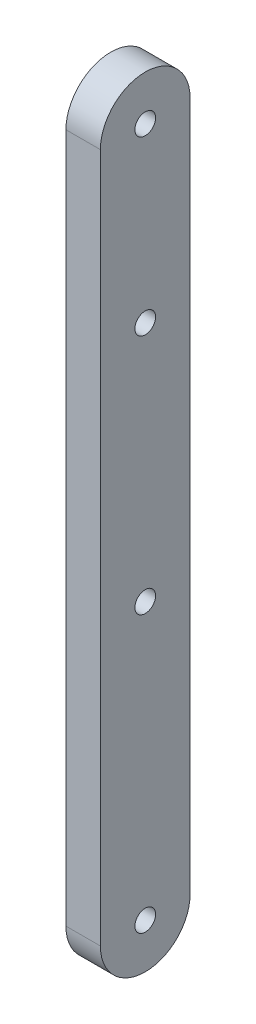
ISO-10303-21;
HEADER;
FILE_DESCRIPTION(('STEP AP214'),'2;1');
FILE_NAME('part.step','',(''),(''),'','','');
FILE_SCHEMA(('AUTOMOTIVE_DESIGN { 1 0 10303 214 1 1 1 1 }'));
ENDSEC;
DATA;
#1=APPLICATION_CONTEXT('core data for automotive mechanical design processes');
#2=APPLICATION_PROTOCOL_DEFINITION('international standard','automotive_design',2000,#1);
#3=PRODUCT_CONTEXT('',#1,'mechanical');
#4=PRODUCT('Part','Part','',(#3));
#5=PRODUCT_RELATED_PRODUCT_CATEGORY('part','',(#4));
#6=PRODUCT_DEFINITION_FORMATION('','',#4);
#7=PRODUCT_DEFINITION_CONTEXT('part definition',#1,'design');
#8=PRODUCT_DEFINITION('design','',#6,#7);
#9=PRODUCT_DEFINITION_SHAPE('','',#8);
#10=(LENGTH_UNIT() NAMED_UNIT(*) SI_UNIT(.MILLI.,.METRE.));
#11=(NAMED_UNIT(*) PLANE_ANGLE_UNIT() SI_UNIT($,.RADIAN.));
#12=(NAMED_UNIT(*) SI_UNIT($,.STERADIAN.) SOLID_ANGLE_UNIT());
#13=UNCERTAINTY_MEASURE_WITH_UNIT(LENGTH_MEASURE(1.E-05),#10,'distance_accuracy_value','');
#14=(GEOMETRIC_REPRESENTATION_CONTEXT(3) GLOBAL_UNCERTAINTY_ASSIGNED_CONTEXT((#13)) GLOBAL_UNIT_ASSIGNED_CONTEXT((#10,
#11,#12)) REPRESENTATION_CONTEXT('',''));
#15=CARTESIAN_POINT('',(0.,0.,0.));
#16=DIRECTION('',(0.,0.,1.));
#17=DIRECTION('',(1.,0.,0.));
#18=AXIS2_PLACEMENT_3D('',#15,#16,#17);
#19=CARTESIAN_POINT('',(5.,50.,0.));
#20=DIRECTION('',(-1.,0.,0.));
#21=DIRECTION('',(0.,0.,1.));
#22=AXIS2_PLACEMENT_3D('',#19,#20,#21);
#23=PLANE('',#22);
#24=CARTESIAN_POINT('',(5.,50.,0.));
#25=DIRECTION('',(1.,0.,0.));
#26=DIRECTION('',(0.,0.,1.));
#27=AXIS2_PLACEMENT_3D('',#24,#25,#26);
#28=CIRCLE('',#27,6.49999999999998);
#29=CARTESIAN_POINT('',(5.,50.,-6.49999999999998));
#30=VERTEX_POINT('',#29);
#31=CARTESIAN_POINT('',(5.,50.,6.49999999999998));
#32=VERTEX_POINT('',#31);
#33=EDGE_CURVE('E92',#30,#32,#28,.T.);
#34=ORIENTED_EDGE('',*,*,#33,.T.);
#35=DIRECTION('',(0.,-1.,0.));
#36=VECTOR('',#35,1.);
#37=CARTESIAN_POINT('',(5.,50.,6.49999999999998));
#38=LINE('',#37,#36);
#39=CARTESIAN_POINT('',(5.,-50.,6.49999999999995));
#40=VERTEX_POINT('',#39);
#41=EDGE_CURVE('E87',#32,#40,#38,.T.);
#42=ORIENTED_EDGE('',*,*,#41,.T.);
#43=CARTESIAN_POINT('',(5.,-50.,0.));
#44=DIRECTION('',(1.,0.,0.));
#45=DIRECTION('',(0.,0.,1.));
#46=AXIS2_PLACEMENT_3D('',#43,#44,#45);
#47=CIRCLE('',#46,6.49999999999998);
#48=CARTESIAN_POINT('',(5.,-50.,-6.49999999999999));
#49=VERTEX_POINT('',#48);
#50=EDGE_CURVE('E90',#40,#49,#47,.T.);
#51=ORIENTED_EDGE('',*,*,#50,.T.);
#52=DIRECTION('',(0.,1.,0.));
#53=VECTOR('',#52,1.);
#54=CARTESIAN_POINT('',(5.,50.,-6.49999999999998));
#55=LINE('',#54,#53);
#56=EDGE_CURVE('E57',#49,#30,#55,.T.);
#57=ORIENTED_EDGE('',*,*,#56,.T.);
#58=EDGE_LOOP('',(#34,#42,#51,#57));
#59=FACE_BOUND('',#58,.T.);
#60=CARTESIAN_POINT('',(5.,50.,0.));
#61=DIRECTION('',(1.,0.,0.));
#62=DIRECTION('',(0.,0.,-1.));
#63=AXIS2_PLACEMENT_3D('',#60,#61,#62);
#64=CIRCLE('',#63,1.5);
#65=CARTESIAN_POINT('',(5.,50.,-1.49999999999998));
#66=VERTEX_POINT('',#65);
#67=EDGE_CURVE('E112',#66,#66,#64,.T.);
#68=ORIENTED_EDGE('',*,*,#67,.F.);
#69=EDGE_LOOP('',(#68));
#70=FACE_BOUND('',#69,.T.);
#71=CARTESIAN_POINT('',(5.,25.,0.));
#72=DIRECTION('',(1.,0.,0.));
#73=DIRECTION('',(0.,0.,-1.));
#74=AXIS2_PLACEMENT_3D('',#71,#72,#73);
#75=CIRCLE('',#74,1.5);
#76=CARTESIAN_POINT('',(5.,25.,-1.5));
#77=VERTEX_POINT('',#76);
#78=EDGE_CURVE('E134',#77,#77,#75,.T.);
#79=ORIENTED_EDGE('',*,*,#78,.F.);
#80=EDGE_LOOP('',(#79));
#81=FACE_BOUND('',#80,.T.);
#82=CARTESIAN_POINT('',(5.,-9.99999999999999,0.));
#83=DIRECTION('',(1.,0.,0.));
#84=DIRECTION('',(0.,0.,-1.));
#85=AXIS2_PLACEMENT_3D('',#82,#83,#84);
#86=CIRCLE('',#85,1.5);
#87=CARTESIAN_POINT('',(5.,-9.99999999999999,-1.50000000000001));
#88=VERTEX_POINT('',#87);
#89=EDGE_CURVE('E142',#88,#88,#86,.T.);
#90=ORIENTED_EDGE('',*,*,#89,.F.);
#91=EDGE_LOOP('',(#90));
#92=FACE_BOUND('',#91,.T.);
#93=CARTESIAN_POINT('',(5.,-50.,0.));
#94=DIRECTION('',(1.,0.,0.));
#95=DIRECTION('',(0.,0.,-1.));
#96=AXIS2_PLACEMENT_3D('',#93,#94,#95);
#97=CIRCLE('',#96,1.5);
#98=CARTESIAN_POINT('',(5.,-50.,-1.50000000000001));
#99=VERTEX_POINT('',#98);
#100=EDGE_CURVE('E150',#99,#99,#97,.T.);
#101=ORIENTED_EDGE('',*,*,#100,.F.);
#102=EDGE_LOOP('',(#101));
#103=FACE_BOUND('',#102,.T.);
#104=ADVANCED_FACE('F39',(#59,#70,#81,#92,#103),#23,.F.);
#105=CARTESIAN_POINT('',(0.,50.,0.));
#106=DIRECTION('',(-1.,0.,0.));
#107=DIRECTION('',(0.,0.,1.));
#108=AXIS2_PLACEMENT_3D('',#105,#106,#107);
#109=PLANE('',#108);
#110=CARTESIAN_POINT('',(0.,-9.99999999999999,0.));
#111=DIRECTION('',(1.,0.,0.));
#112=DIRECTION('',(0.,0.,-1.));
#113=AXIS2_PLACEMENT_3D('',#110,#111,#112);
#114=CIRCLE('',#113,1.5);
#115=CARTESIAN_POINT('',(0.,-9.99999999999999,-1.50000000000001));
#116=VERTEX_POINT('',#115);
#117=EDGE_CURVE('E146',#116,#116,#114,.T.);
#118=ORIENTED_EDGE('',*,*,#117,.T.);
#119=EDGE_LOOP('',(#118));
#120=FACE_BOUND('',#119,.T.);
#121=CARTESIAN_POINT('',(0.,50.,0.));
#122=DIRECTION('',(1.,0.,0.));
#123=DIRECTION('',(0.,0.,-1.));
#124=AXIS2_PLACEMENT_3D('',#121,#122,#123);
#125=CIRCLE('',#124,1.5);
#126=CARTESIAN_POINT('',(0.,50.,-1.49999999999998));
#127=VERTEX_POINT('',#126);
#128=EDGE_CURVE('E130',#127,#127,#125,.T.);
#129=ORIENTED_EDGE('',*,*,#128,.T.);
#130=EDGE_LOOP('',(#129));
#131=FACE_BOUND('',#130,.T.);
#132=CARTESIAN_POINT('',(0.,50.,0.));
#133=DIRECTION('',(1.,0.,0.));
#134=DIRECTION('',(0.,0.,1.));
#135=AXIS2_PLACEMENT_3D('',#132,#133,#134);
#136=CIRCLE('',#135,6.49999999999998);
#137=CARTESIAN_POINT('',(0.,50.,-6.49999999999998));
#138=VERTEX_POINT('',#137);
#139=CARTESIAN_POINT('',(0.,50.,6.49999999999998));
#140=VERTEX_POINT('',#139);
#141=EDGE_CURVE('E108',#138,#140,#136,.T.);
#142=ORIENTED_EDGE('',*,*,#141,.F.);
#143=DIRECTION('',(0.,1.,0.));
#144=VECTOR('',#143,1.);
#145=CARTESIAN_POINT('',(0.,50.,-6.49999999999998));
#146=LINE('',#145,#144);
#147=CARTESIAN_POINT('',(0.,-50.,-6.49999999999999));
#148=VERTEX_POINT('',#147);
#149=EDGE_CURVE('E80',#148,#138,#146,.T.);
#150=ORIENTED_EDGE('',*,*,#149,.F.);
#151=CARTESIAN_POINT('',(0.,-50.,0.));
#152=DIRECTION('',(1.,0.,0.));
#153=DIRECTION('',(0.,0.,1.));
#154=AXIS2_PLACEMENT_3D('',#151,#152,#153);
#155=CIRCLE('',#154,6.49999999999998);
#156=CARTESIAN_POINT('',(0.,-50.,6.49999999999995));
#157=VERTEX_POINT('',#156);
#158=EDGE_CURVE('E74',#157,#148,#155,.T.);
#159=ORIENTED_EDGE('',*,*,#158,.F.);
#160=DIRECTION('',(0.,-1.,0.));
#161=VECTOR('',#160,1.);
#162=CARTESIAN_POINT('',(0.,50.,6.49999999999998));
#163=LINE('',#162,#161);
#164=EDGE_CURVE('E97',#140,#157,#163,.T.);
#165=ORIENTED_EDGE('',*,*,#164,.F.);
#166=EDGE_LOOP('',(#142,#150,#159,#165));
#167=FACE_BOUND('',#166,.T.);
#168=CARTESIAN_POINT('',(0.,25.,0.));
#169=DIRECTION('',(1.,0.,0.));
#170=DIRECTION('',(0.,0.,-1.));
#171=AXIS2_PLACEMENT_3D('',#168,#169,#170);
#172=CIRCLE('',#171,1.5);
#173=CARTESIAN_POINT('',(0.,25.,-1.5));
#174=VERTEX_POINT('',#173);
#175=EDGE_CURVE('E138',#174,#174,#172,.T.);
#176=ORIENTED_EDGE('',*,*,#175,.T.);
#177=EDGE_LOOP('',(#176));
#178=FACE_BOUND('',#177,.T.);
#179=CARTESIAN_POINT('',(0.,-50.,0.));
#180=DIRECTION('',(1.,0.,0.));
#181=DIRECTION('',(0.,0.,-1.));
#182=AXIS2_PLACEMENT_3D('',#179,#180,#181);
#183=CIRCLE('',#182,1.5);
#184=CARTESIAN_POINT('',(0.,-50.,-1.50000000000001));
#185=VERTEX_POINT('',#184);
#186=EDGE_CURVE('E154',#185,#185,#183,.T.);
#187=ORIENTED_EDGE('',*,*,#186,.T.);
#188=EDGE_LOOP('',(#187));
#189=FACE_BOUND('',#188,.T.);
#190=ADVANCED_FACE('F125',(#120,#131,#167,#178,#189),#109,.T.);
#191=CARTESIAN_POINT('',(5.,50.,0.));
#192=DIRECTION('',(-1.,0.,0.));
#193=DIRECTION('',(0.,0.,1.));
#194=AXIS2_PLACEMENT_3D('',#191,#192,#193);
#195=CYLINDRICAL_SURFACE('',#194,6.49999999999998);
#196=ORIENTED_EDGE('',*,*,#141,.T.);
#197=DIRECTION('',(-1.,0.,0.));
#198=VECTOR('',#197,1.);
#199=CARTESIAN_POINT('',(5.,50.,6.49999999999998));
#200=LINE('',#199,#198);
#201=EDGE_CURVE('E11',#32,#140,#200,.T.);
#202=ORIENTED_EDGE('',*,*,#201,.F.);
#203=ORIENTED_EDGE('',*,*,#33,.F.);
#204=DIRECTION('',(-1.,0.,0.));
#205=VECTOR('',#204,1.);
#206=CARTESIAN_POINT('',(5.,50.,-6.49999999999998));
#207=LINE('',#206,#205);
#208=EDGE_CURVE('E104',#30,#138,#207,.T.);
#209=ORIENTED_EDGE('',*,*,#208,.T.);
#210=EDGE_LOOP('',(#196,#202,#203,#209));
#211=FACE_BOUND('',#210,.T.);
#212=ADVANCED_FACE('F41',(#211),#195,.T.);
#213=CARTESIAN_POINT('',(5.,50.,6.49999999999998));
#214=DIRECTION('',(0.,0.,-1.));
#215=DIRECTION('',(0.,1.,0.));
#216=AXIS2_PLACEMENT_3D('',#213,#214,#215);
#217=PLANE('',#216);
#218=ORIENTED_EDGE('',*,*,#164,.T.);
#219=DIRECTION('',(-1.,0.,0.));
#220=VECTOR('',#219,1.);
#221=CARTESIAN_POINT('',(5.,-50.,6.49999999999995));
#222=LINE('',#221,#220);
#223=EDGE_CURVE('E49',#40,#157,#222,.T.);
#224=ORIENTED_EDGE('',*,*,#223,.F.);
#225=ORIENTED_EDGE('',*,*,#41,.F.);
#226=ORIENTED_EDGE('',*,*,#201,.T.);
#227=EDGE_LOOP('',(#218,#224,#225,#226));
#228=FACE_BOUND('',#227,.T.);
#229=ADVANCED_FACE('F96',(#228),#217,.F.);
#230=CARTESIAN_POINT('',(5.,-50.,0.));
#231=DIRECTION('',(-1.,0.,0.));
#232=DIRECTION('',(0.,0.,1.));
#233=AXIS2_PLACEMENT_3D('',#230,#231,#232);
#234=CYLINDRICAL_SURFACE('',#233,6.49999999999998);
#235=ORIENTED_EDGE('',*,*,#158,.T.);
#236=DIRECTION('',(-1.,0.,0.));
#237=VECTOR('',#236,1.);
#238=CARTESIAN_POINT('',(5.,-50.,-6.49999999999999));
#239=LINE('',#238,#237);
#240=EDGE_CURVE('E99',#49,#148,#239,.T.);
#241=ORIENTED_EDGE('',*,*,#240,.F.);
#242=ORIENTED_EDGE('',*,*,#50,.F.);
#243=ORIENTED_EDGE('',*,*,#223,.T.);
#244=EDGE_LOOP('',(#235,#241,#242,#243));
#245=FACE_BOUND('',#244,.T.);
#246=ADVANCED_FACE('F100',(#245),#234,.T.);
#247=CARTESIAN_POINT('',(5.,50.,-6.49999999999998));
#248=DIRECTION('',(0.,0.,1.));
#249=DIRECTION('',(0.,-1.,0.));
#250=AXIS2_PLACEMENT_3D('',#247,#248,#249);
#251=PLANE('',#250);
#252=ORIENTED_EDGE('',*,*,#149,.T.);
#253=ORIENTED_EDGE('',*,*,#208,.F.);
#254=ORIENTED_EDGE('',*,*,#56,.F.);
#255=ORIENTED_EDGE('',*,*,#240,.T.);
#256=EDGE_LOOP('',(#252,#253,#254,#255));
#257=FACE_BOUND('',#256,.T.);
#258=ADVANCED_FACE('F122',(#257),#251,.F.);
#259=CARTESIAN_POINT('',(5.,50.,0.));
#260=DIRECTION('',(-1.,0.,0.));
#261=DIRECTION('',(0.,0.,1.));
#262=AXIS2_PLACEMENT_3D('',#259,#260,#261);
#263=CYLINDRICAL_SURFACE('',#262,1.5);
#264=ORIENTED_EDGE('',*,*,#67,.T.);
#265=EDGE_LOOP('',(#264));
#266=FACE_BOUND('',#265,.T.);
#267=ORIENTED_EDGE('',*,*,#128,.F.);
#268=EDGE_LOOP('',(#267));
#269=FACE_BOUND('',#268,.T.);
#270=ADVANCED_FACE('F173',(#266,#269),#263,.F.);
#271=CARTESIAN_POINT('',(5.,25.,0.));
#272=DIRECTION('',(-1.,0.,0.));
#273=DIRECTION('',(0.,0.,1.));
#274=AXIS2_PLACEMENT_3D('',#271,#272,#273);
#275=CYLINDRICAL_SURFACE('',#274,1.5);
#276=ORIENTED_EDGE('',*,*,#78,.T.);
#277=EDGE_LOOP('',(#276));
#278=FACE_BOUND('',#277,.T.);
#279=ORIENTED_EDGE('',*,*,#175,.F.);
#280=EDGE_LOOP('',(#279));
#281=FACE_BOUND('',#280,.T.);
#282=ADVANCED_FACE('F219',(#278,#281),#275,.F.);
#283=CARTESIAN_POINT('',(5.,-9.99999999999999,0.));
#284=DIRECTION('',(-1.,0.,0.));
#285=DIRECTION('',(0.,0.,1.));
#286=AXIS2_PLACEMENT_3D('',#283,#284,#285);
#287=CYLINDRICAL_SURFACE('',#286,1.5);
#288=ORIENTED_EDGE('',*,*,#89,.T.);
#289=EDGE_LOOP('',(#288));
#290=FACE_BOUND('',#289,.T.);
#291=ORIENTED_EDGE('',*,*,#117,.F.);
#292=EDGE_LOOP('',(#291));
#293=FACE_BOUND('',#292,.T.);
#294=ADVANCED_FACE('F227',(#290,#293),#287,.F.);
#295=CARTESIAN_POINT('',(5.,-50.,0.));
#296=DIRECTION('',(-1.,0.,0.));
#297=DIRECTION('',(0.,0.,1.));
#298=AXIS2_PLACEMENT_3D('',#295,#296,#297);
#299=CYLINDRICAL_SURFACE('',#298,1.5);
#300=ORIENTED_EDGE('',*,*,#100,.T.);
#301=EDGE_LOOP('',(#300));
#302=FACE_BOUND('',#301,.T.);
#303=ORIENTED_EDGE('',*,*,#186,.F.);
#304=EDGE_LOOP('',(#303));
#305=FACE_BOUND('',#304,.T.);
#306=ADVANCED_FACE('F162',(#302,#305),#299,.F.);
#307=CLOSED_SHELL('',(#104,#190,#212,#229,#246,#258,#270,#282,#294,#306));
#308=MANIFOLD_SOLID_BREP('B2',#307);
#309=ADVANCED_BREP_SHAPE_REPRESENTATION('',(#18,#308),#14);
#310=SHAPE_DEFINITION_REPRESENTATION(#9,#309);
ENDSEC;
END-ISO-10303-21;
